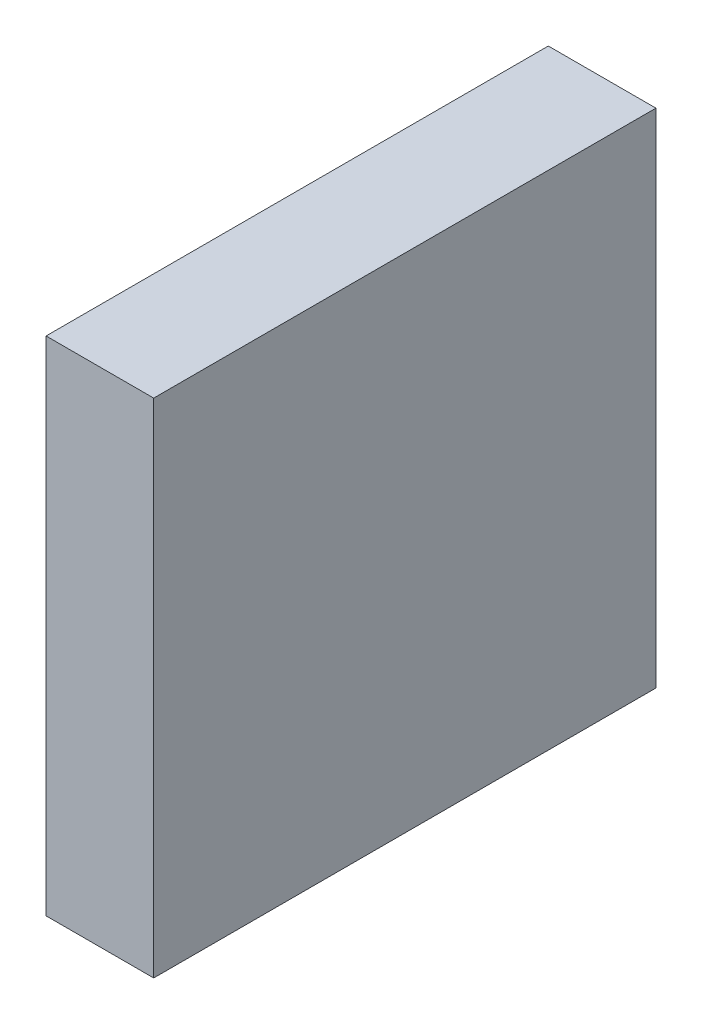
ISO-10303-21;
HEADER;
FILE_DESCRIPTION(('STEP AP214'),'2;1');
FILE_NAME('part.step','',(''),(''),'','','');
FILE_SCHEMA(('AUTOMOTIVE_DESIGN { 1 0 10303 214 1 1 1 1 }'));
ENDSEC;
DATA;
#1=APPLICATION_CONTEXT('core data for automotive mechanical design processes');
#2=APPLICATION_PROTOCOL_DEFINITION('international standard','automotive_design',2000,#1);
#3=PRODUCT_CONTEXT('',#1,'mechanical');
#4=PRODUCT('Part','Part','',(#3));
#5=PRODUCT_RELATED_PRODUCT_CATEGORY('part','',(#4));
#6=PRODUCT_DEFINITION_FORMATION('','',#4);
#7=PRODUCT_DEFINITION_CONTEXT('part definition',#1,'design');
#8=PRODUCT_DEFINITION('design','',#6,#7);
#9=PRODUCT_DEFINITION_SHAPE('','',#8);
#10=(LENGTH_UNIT() NAMED_UNIT(*) SI_UNIT(.MILLI.,.METRE.));
#11=(NAMED_UNIT(*) PLANE_ANGLE_UNIT() SI_UNIT($,.RADIAN.));
#12=(NAMED_UNIT(*) SI_UNIT($,.STERADIAN.) SOLID_ANGLE_UNIT());
#13=UNCERTAINTY_MEASURE_WITH_UNIT(LENGTH_MEASURE(1.E-05),#10,'distance_accuracy_value','');
#14=(GEOMETRIC_REPRESENTATION_CONTEXT(3) GLOBAL_UNCERTAINTY_ASSIGNED_CONTEXT((#13)) GLOBAL_UNIT_ASSIGNED_CONTEXT((#10,
#11,#12)) REPRESENTATION_CONTEXT('',''));
#15=CARTESIAN_POINT('',(0.,0.,0.));
#16=DIRECTION('',(0.,0.,1.));
#17=DIRECTION('',(1.,0.,0.));
#18=AXIS2_PLACEMENT_3D('',#15,#16,#17);
#19=CARTESIAN_POINT('',(172.5,480.,-470.));
#20=DIRECTION('',(-1.,0.,0.));
#21=DIRECTION('',(0.,0.,1.));
#22=AXIS2_PLACEMENT_3D('',#19,#20,#21);
#23=PLANE('',#22);
#24=DIRECTION('',(0.,-1.,0.));
#25=VECTOR('',#24,1.);
#26=CARTESIAN_POINT('',(172.5,480.,-330.));
#27=LINE('',#26,#25);
#28=CARTESIAN_POINT('',(172.5,620.,-330.));
#29=VERTEX_POINT('',#28);
#30=CARTESIAN_POINT('',(172.5,480.,-330.));
#31=VERTEX_POINT('',#30);
#32=EDGE_CURVE('E103',#29,#31,#27,.T.);
#33=ORIENTED_EDGE('',*,*,#32,.F.);
#34=DIRECTION('',(0.,0.,1.));
#35=VECTOR('',#34,1.);
#36=CARTESIAN_POINT('',(172.5,620.,-470.));
#37=LINE('',#36,#35);
#38=CARTESIAN_POINT('',(172.5,620.,-470.));
#39=VERTEX_POINT('',#38);
#40=EDGE_CURVE('E11',#39,#29,#37,.T.);
#41=ORIENTED_EDGE('',*,*,#40,.F.);
#42=DIRECTION('',(0.,-1.,0.));
#43=VECTOR('',#42,1.);
#44=CARTESIAN_POINT('',(172.5,480.,-470.));
#45=LINE('',#44,#43);
#46=CARTESIAN_POINT('',(172.5,480.,-470.));
#47=VERTEX_POINT('',#46);
#48=EDGE_CURVE('E97',#39,#47,#45,.T.);
#49=ORIENTED_EDGE('',*,*,#48,.T.);
#50=DIRECTION('',(0.,0.,1.));
#51=VECTOR('',#50,1.);
#52=CARTESIAN_POINT('',(172.5,480.,-470.));
#53=LINE('',#52,#51);
#54=EDGE_CURVE('E42',#47,#31,#53,.T.);
#55=ORIENTED_EDGE('',*,*,#54,.T.);
#56=EDGE_LOOP('',(#33,#41,#49,#55));
#57=FACE_BOUND('',#56,.T.);
#58=ADVANCED_FACE('F39',(#57),#23,.T.);
#59=CARTESIAN_POINT('',(172.5,620.,-470.));
#60=DIRECTION('',(0.,1.,0.));
#61=DIRECTION('',(0.,0.,1.));
#62=AXIS2_PLACEMENT_3D('',#59,#60,#61);
#63=PLANE('',#62);
#64=DIRECTION('',(-1.,0.,0.));
#65=VECTOR('',#64,1.);
#66=CARTESIAN_POINT('',(172.5,620.,-330.));
#67=LINE('',#66,#65);
#68=CARTESIAN_POINT('',(202.5,620.,-330.));
#69=VERTEX_POINT('',#68);
#70=EDGE_CURVE('E99',#69,#29,#67,.T.);
#71=ORIENTED_EDGE('',*,*,#70,.F.);
#72=DIRECTION('',(0.,0.,1.));
#73=VECTOR('',#72,1.);
#74=CARTESIAN_POINT('',(202.5,620.,-470.));
#75=LINE('',#74,#73);
#76=CARTESIAN_POINT('',(202.5,620.,-470.));
#77=VERTEX_POINT('',#76);
#78=EDGE_CURVE('E48',#77,#69,#75,.T.);
#79=ORIENTED_EDGE('',*,*,#78,.F.);
#80=DIRECTION('',(-1.,0.,0.));
#81=VECTOR('',#80,1.);
#82=CARTESIAN_POINT('',(172.5,620.,-470.));
#83=LINE('',#82,#81);
#84=EDGE_CURVE('E94',#77,#39,#83,.T.);
#85=ORIENTED_EDGE('',*,*,#84,.T.);
#86=ORIENTED_EDGE('',*,*,#40,.T.);
#87=EDGE_LOOP('',(#71,#79,#85,#86));
#88=FACE_BOUND('',#87,.T.);
#89=ADVANCED_FACE('F113',(#88),#63,.T.);
#90=CARTESIAN_POINT('',(202.5,480.,-470.));
#91=DIRECTION('',(1.,0.,0.));
#92=DIRECTION('',(0.,0.,-1.));
#93=AXIS2_PLACEMENT_3D('',#90,#91,#92);
#94=PLANE('',#93);
#95=DIRECTION('',(0.,1.,0.));
#96=VECTOR('',#95,1.);
#97=CARTESIAN_POINT('',(202.5,480.,-330.));
#98=LINE('',#97,#96);
#99=CARTESIAN_POINT('',(202.5,480.,-330.));
#100=VERTEX_POINT('',#99);
#101=EDGE_CURVE('E89',#100,#69,#98,.T.);
#102=ORIENTED_EDGE('',*,*,#101,.F.);
#103=DIRECTION('',(0.,0.,1.));
#104=VECTOR('',#103,1.);
#105=CARTESIAN_POINT('',(202.5,480.,-470.));
#106=LINE('',#105,#104);
#107=CARTESIAN_POINT('',(202.5,480.,-470.));
#108=VERTEX_POINT('',#107);
#109=EDGE_CURVE('E84',#108,#100,#106,.T.);
#110=ORIENTED_EDGE('',*,*,#109,.F.);
#111=DIRECTION('',(0.,1.,0.));
#112=VECTOR('',#111,1.);
#113=CARTESIAN_POINT('',(202.5,480.,-470.));
#114=LINE('',#113,#112);
#115=EDGE_CURVE('E87',#108,#77,#114,.T.);
#116=ORIENTED_EDGE('',*,*,#115,.T.);
#117=ORIENTED_EDGE('',*,*,#78,.T.);
#118=EDGE_LOOP('',(#102,#110,#116,#117));
#119=FACE_BOUND('',#118,.T.);
#120=ADVANCED_FACE('F86',(#119),#94,.T.);
#121=CARTESIAN_POINT('',(172.5,480.,-470.));
#122=DIRECTION('',(0.,-1.,0.));
#123=DIRECTION('',(0.,0.,-1.));
#124=AXIS2_PLACEMENT_3D('',#121,#122,#123);
#125=PLANE('',#124);
#126=DIRECTION('',(1.,0.,0.));
#127=VECTOR('',#126,1.);
#128=CARTESIAN_POINT('',(172.5,480.,-330.));
#129=LINE('',#128,#127);
#130=EDGE_CURVE('E106',#31,#100,#129,.T.);
#131=ORIENTED_EDGE('',*,*,#130,.F.);
#132=ORIENTED_EDGE('',*,*,#54,.F.);
#133=DIRECTION('',(1.,0.,0.));
#134=VECTOR('',#133,1.);
#135=CARTESIAN_POINT('',(172.5,480.,-470.));
#136=LINE('',#135,#134);
#137=EDGE_CURVE('E93',#47,#108,#136,.T.);
#138=ORIENTED_EDGE('',*,*,#137,.T.);
#139=ORIENTED_EDGE('',*,*,#109,.T.);
#140=EDGE_LOOP('',(#131,#132,#138,#139));
#141=FACE_BOUND('',#140,.T.);
#142=ADVANCED_FACE('F96',(#141),#125,.T.);
#143=CARTESIAN_POINT('',(0.,0.,-470.));
#144=DIRECTION('',(0.,0.,-1.));
#145=DIRECTION('',(-1.,0.,0.));
#146=AXIS2_PLACEMENT_3D('',#143,#144,#145);
#147=PLANE('',#146);
#148=ORIENTED_EDGE('',*,*,#48,.F.);
#149=ORIENTED_EDGE('',*,*,#84,.F.);
#150=ORIENTED_EDGE('',*,*,#115,.F.);
#151=ORIENTED_EDGE('',*,*,#137,.F.);
#152=EDGE_LOOP('',(#148,#149,#150,#151));
#153=FACE_BOUND('',#152,.T.);
#154=ADVANCED_FACE('F92',(#153),#147,.T.);
#155=CARTESIAN_POINT('',(0.,0.,-330.));
#156=DIRECTION('',(0.,0.,-1.));
#157=DIRECTION('',(-1.,0.,0.));
#158=AXIS2_PLACEMENT_3D('',#155,#156,#157);
#159=PLANE('',#158);
#160=ORIENTED_EDGE('',*,*,#32,.T.);
#161=ORIENTED_EDGE('',*,*,#130,.T.);
#162=ORIENTED_EDGE('',*,*,#101,.T.);
#163=ORIENTED_EDGE('',*,*,#70,.T.);
#164=EDGE_LOOP('',(#160,#161,#162,#163));
#165=FACE_BOUND('',#164,.T.);
#166=ADVANCED_FACE('F112',(#165),#159,.F.);
#167=CLOSED_SHELL('',(#58,#89,#120,#142,#154,#166));
#168=MANIFOLD_SOLID_BREP('B2',#167);
#169=ADVANCED_BREP_SHAPE_REPRESENTATION('',(#18,#168),#14);
#170=SHAPE_DEFINITION_REPRESENTATION(#9,#169);
ENDSEC;
END-ISO-10303-21;
